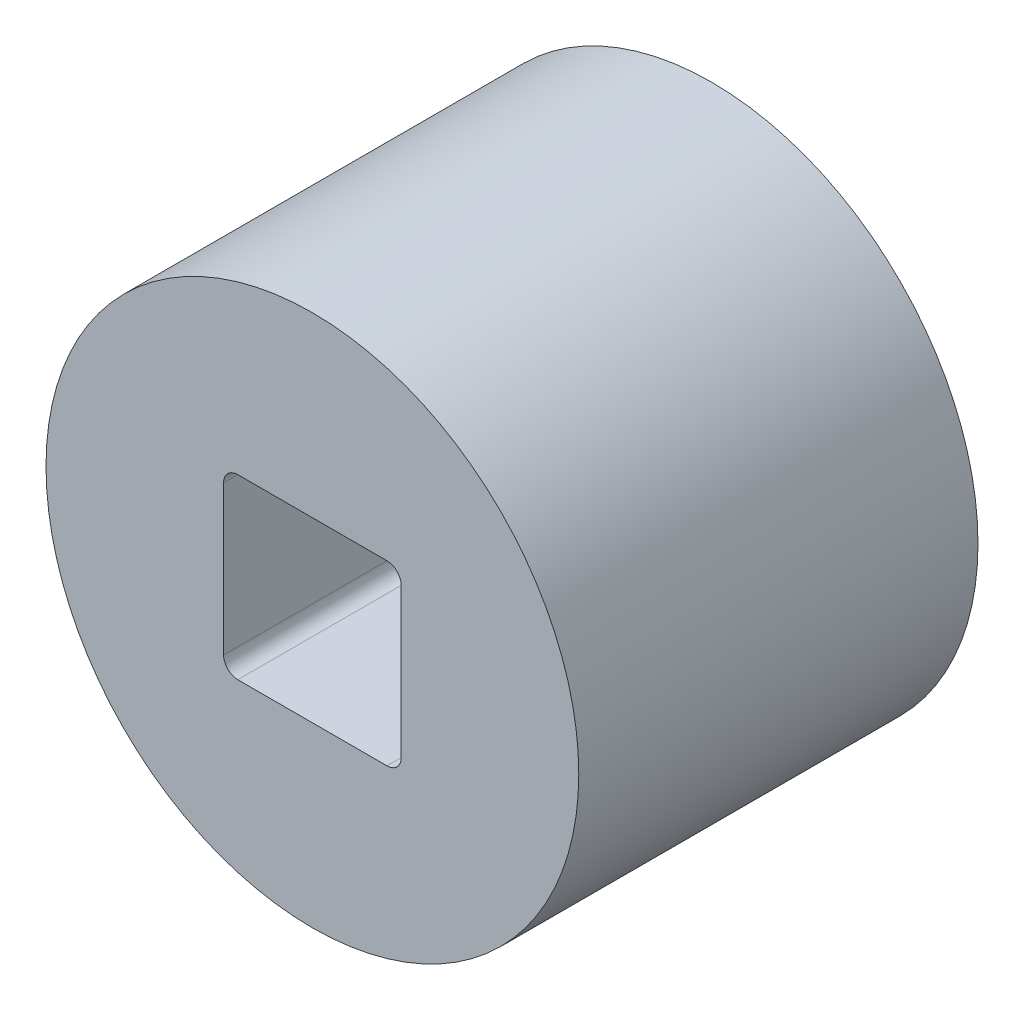
ISO-10303-21;
HEADER;
FILE_DESCRIPTION(('STEP AP214'),'2;1');
FILE_NAME('part.step','',(''),(''),'','','');
FILE_SCHEMA(('AUTOMOTIVE_DESIGN { 1 0 10303 214 1 1 1 1 }'));
ENDSEC;
DATA;
#1=APPLICATION_CONTEXT('core data for automotive mechanical design processes');
#2=APPLICATION_PROTOCOL_DEFINITION('international standard','automotive_design',2000,#1);
#3=PRODUCT_CONTEXT('',#1,'mechanical');
#4=PRODUCT('Part','Part','',(#3));
#5=PRODUCT_RELATED_PRODUCT_CATEGORY('part','',(#4));
#6=PRODUCT_DEFINITION_FORMATION('','',#4);
#7=PRODUCT_DEFINITION_CONTEXT('part definition',#1,'design');
#8=PRODUCT_DEFINITION('design','',#6,#7);
#9=PRODUCT_DEFINITION_SHAPE('','',#8);
#10=(LENGTH_UNIT() NAMED_UNIT(*) SI_UNIT(.MILLI.,.METRE.));
#11=(NAMED_UNIT(*) PLANE_ANGLE_UNIT() SI_UNIT($,.RADIAN.));
#12=(NAMED_UNIT(*) SI_UNIT($,.STERADIAN.) SOLID_ANGLE_UNIT());
#13=UNCERTAINTY_MEASURE_WITH_UNIT(LENGTH_MEASURE(1.E-05),#10,'distance_accuracy_value','');
#14=(GEOMETRIC_REPRESENTATION_CONTEXT(3) GLOBAL_UNCERTAINTY_ASSIGNED_CONTEXT((#13)) GLOBAL_UNIT_ASSIGNED_CONTEXT((#10,
#11,#12)) REPRESENTATION_CONTEXT('',''));
#15=CARTESIAN_POINT('',(0.,0.,0.));
#16=DIRECTION('',(0.,0.,1.));
#17=DIRECTION('',(1.,0.,0.));
#18=AXIS2_PLACEMENT_3D('',#15,#16,#17);
#19=CARTESIAN_POINT('',(0.,0.,7.1374));
#20=DIRECTION('',(0.,0.,1.));
#21=DIRECTION('',(1.,0.,0.));
#22=AXIS2_PLACEMENT_3D('',#19,#20,#21);
#23=PLANE('',#22);
#24=CARTESIAN_POINT('',(0.,0.,7.1374));
#25=DIRECTION('',(0.,0.,1.));
#26=DIRECTION('',(1.,0.,0.));
#27=AXIS2_PLACEMENT_3D('',#24,#25,#26);
#28=CIRCLE('',#27,4.7625);
#29=CARTESIAN_POINT('',(4.7625,0.,7.1374));
#30=VERTEX_POINT('',#29);
#31=EDGE_CURVE('E11',#30,#30,#28,.T.);
#32=ORIENTED_EDGE('',*,*,#31,.T.);
#33=EDGE_LOOP('',(#32));
#34=FACE_BOUND('',#33,.T.);
#35=DIRECTION('',(1.,0.,0.));
#36=VECTOR('',#35,1.);
#37=CARTESIAN_POINT('',(1.3335,-1.5875,7.1374));
#38=LINE('',#37,#36);
#39=CARTESIAN_POINT('',(-1.3335,-1.5875,7.1374));
#40=VERTEX_POINT('',#39);
#41=CARTESIAN_POINT('',(1.3335,-1.5875,7.1374));
#42=VERTEX_POINT('',#41);
#43=EDGE_CURVE('E114',#40,#42,#38,.T.);
#44=ORIENTED_EDGE('',*,*,#43,.F.);
#45=CARTESIAN_POINT('',(-1.3335,-1.3335,7.1374));
#46=DIRECTION('',(0.,0.,1.));
#47=DIRECTION('',(1.,0.,0.));
#48=AXIS2_PLACEMENT_3D('',#45,#46,#47);
#49=CIRCLE('',#48,0.254);
#50=CARTESIAN_POINT('',(-1.5875,-1.3335,7.1374));
#51=VERTEX_POINT('',#50);
#52=EDGE_CURVE('E105',#51,#40,#49,.T.);
#53=ORIENTED_EDGE('',*,*,#52,.F.);
#54=DIRECTION('',(0.,-1.,0.));
#55=VECTOR('',#54,1.);
#56=CARTESIAN_POINT('',(-1.5875,1.3335,7.1374));
#57=LINE('',#56,#55);
#58=CARTESIAN_POINT('',(-1.5875,1.3335,7.1374));
#59=VERTEX_POINT('',#58);
#60=EDGE_CURVE('E145',#59,#51,#57,.T.);
#61=ORIENTED_EDGE('',*,*,#60,.F.);
#62=CARTESIAN_POINT('',(-1.3335,1.3335,7.1374));
#63=DIRECTION('',(0.,0.,1.));
#64=DIRECTION('',(-1.,0.,0.));
#65=AXIS2_PLACEMENT_3D('',#62,#63,#64);
#66=CIRCLE('',#65,0.254);
#67=CARTESIAN_POINT('',(-1.3335,1.5875,7.1374));
#68=VERTEX_POINT('',#67);
#69=EDGE_CURVE('E142',#68,#59,#66,.T.);
#70=ORIENTED_EDGE('',*,*,#69,.F.);
#71=DIRECTION('',(-1.,0.,0.));
#72=VECTOR('',#71,1.);
#73=CARTESIAN_POINT('',(1.3335,1.5875,7.1374));
#74=LINE('',#73,#72);
#75=CARTESIAN_POINT('',(1.3335,1.5875,7.1374));
#76=VERTEX_POINT('',#75);
#77=EDGE_CURVE('E139',#76,#68,#74,.T.);
#78=ORIENTED_EDGE('',*,*,#77,.F.);
#79=CARTESIAN_POINT('',(1.3335,1.3335,7.1374));
#80=DIRECTION('',(0.,0.,1.));
#81=DIRECTION('',(1.,0.,0.));
#82=AXIS2_PLACEMENT_3D('',#79,#80,#81);
#83=CIRCLE('',#82,0.254);
#84=CARTESIAN_POINT('',(1.5875,1.3335,7.1374));
#85=VERTEX_POINT('',#84);
#86=EDGE_CURVE('E136',#85,#76,#83,.T.);
#87=ORIENTED_EDGE('',*,*,#86,.F.);
#88=DIRECTION('',(0.,1.,0.));
#89=VECTOR('',#88,1.);
#90=CARTESIAN_POINT('',(1.5875,1.3335,7.1374));
#91=LINE('',#90,#89);
#92=CARTESIAN_POINT('',(1.5875,-1.3335,7.1374));
#93=VERTEX_POINT('',#92);
#94=EDGE_CURVE('E131',#93,#85,#91,.T.);
#95=ORIENTED_EDGE('',*,*,#94,.F.);
#96=CARTESIAN_POINT('',(1.3335,-1.3335,7.1374));
#97=DIRECTION('',(0.,0.,1.));
#98=DIRECTION('',(1.,0.,0.));
#99=AXIS2_PLACEMENT_3D('',#96,#97,#98);
#100=CIRCLE('',#99,0.254);
#101=EDGE_CURVE('E127',#42,#93,#100,.T.);
#102=ORIENTED_EDGE('',*,*,#101,.F.);
#103=EDGE_LOOP('',(#44,#53,#61,#70,#78,#87,#95,#102));
#104=FACE_BOUND('',#103,.T.);
#105=ADVANCED_FACE('F39',(#34,#104),#23,.T.);
#106=CARTESIAN_POINT('',(0.,0.,0.));
#107=DIRECTION('',(0.,0.,1.));
#108=DIRECTION('',(1.,0.,0.));
#109=AXIS2_PLACEMENT_3D('',#106,#107,#108);
#110=PLANE('',#109);
#111=CARTESIAN_POINT('',(0.,0.,0.));
#112=DIRECTION('',(0.,0.,1.));
#113=DIRECTION('',(1.,0.,0.));
#114=AXIS2_PLACEMENT_3D('',#111,#112,#113);
#115=CIRCLE('',#114,4.7625);
#116=CARTESIAN_POINT('',(4.7625,0.,0.));
#117=VERTEX_POINT('',#116);
#118=EDGE_CURVE('E43',#117,#117,#115,.T.);
#119=ORIENTED_EDGE('',*,*,#118,.F.);
#120=EDGE_LOOP('',(#119));
#121=FACE_BOUND('',#120,.T.);
#122=CARTESIAN_POINT('',(-1.3335,-1.3335,0.));
#123=DIRECTION('',(0.,0.,1.));
#124=DIRECTION('',(1.,0.,0.));
#125=AXIS2_PLACEMENT_3D('',#122,#123,#124);
#126=CIRCLE('',#125,0.254);
#127=CARTESIAN_POINT('',(-1.5875,-1.3335,0.));
#128=VERTEX_POINT('',#127);
#129=CARTESIAN_POINT('',(-1.3335,-1.5875,0.));
#130=VERTEX_POINT('',#129);
#131=EDGE_CURVE('E63',#128,#130,#126,.T.);
#132=ORIENTED_EDGE('',*,*,#131,.T.);
#133=DIRECTION('',(1.,0.,0.));
#134=VECTOR('',#133,1.);
#135=CARTESIAN_POINT('',(1.3335,-1.5875,0.));
#136=LINE('',#135,#134);
#137=CARTESIAN_POINT('',(1.3335,-1.5875,0.));
#138=VERTEX_POINT('',#137);
#139=EDGE_CURVE('E121',#130,#138,#136,.T.);
#140=ORIENTED_EDGE('',*,*,#139,.T.);
#141=CARTESIAN_POINT('',(1.3335,-1.3335,0.));
#142=DIRECTION('',(0.,0.,1.));
#143=DIRECTION('',(1.,0.,0.));
#144=AXIS2_PLACEMENT_3D('',#141,#142,#143);
#145=CIRCLE('',#144,0.254);
#146=CARTESIAN_POINT('',(1.5875,-1.3335,0.));
#147=VERTEX_POINT('',#146);
#148=EDGE_CURVE('E152',#138,#147,#145,.T.);
#149=ORIENTED_EDGE('',*,*,#148,.T.);
#150=DIRECTION('',(0.,1.,0.));
#151=VECTOR('',#150,1.);
#152=CARTESIAN_POINT('',(1.5875,1.3335,0.));
#153=LINE('',#152,#151);
#154=CARTESIAN_POINT('',(1.5875,1.3335,0.));
#155=VERTEX_POINT('',#154);
#156=EDGE_CURVE('E156',#147,#155,#153,.T.);
#157=ORIENTED_EDGE('',*,*,#156,.T.);
#158=CARTESIAN_POINT('',(1.3335,1.3335,0.));
#159=DIRECTION('',(0.,0.,1.));
#160=DIRECTION('',(1.,0.,0.));
#161=AXIS2_PLACEMENT_3D('',#158,#159,#160);
#162=CIRCLE('',#161,0.254);
#163=CARTESIAN_POINT('',(1.3335,1.5875,0.));
#164=VERTEX_POINT('',#163);
#165=EDGE_CURVE('E160',#155,#164,#162,.T.);
#166=ORIENTED_EDGE('',*,*,#165,.T.);
#167=DIRECTION('',(-1.,0.,0.));
#168=VECTOR('',#167,1.);
#169=CARTESIAN_POINT('',(1.3335,1.5875,0.));
#170=LINE('',#169,#168);
#171=CARTESIAN_POINT('',(-1.3335,1.5875,0.));
#172=VERTEX_POINT('',#171);
#173=EDGE_CURVE('E164',#164,#172,#170,.T.);
#174=ORIENTED_EDGE('',*,*,#173,.T.);
#175=CARTESIAN_POINT('',(-1.3335,1.3335,0.));
#176=DIRECTION('',(0.,0.,1.));
#177=DIRECTION('',(-1.,0.,0.));
#178=AXIS2_PLACEMENT_3D('',#175,#176,#177);
#179=CIRCLE('',#178,0.254);
#180=CARTESIAN_POINT('',(-1.5875,1.3335,0.));
#181=VERTEX_POINT('',#180);
#182=EDGE_CURVE('E168',#172,#181,#179,.T.);
#183=ORIENTED_EDGE('',*,*,#182,.T.);
#184=DIRECTION('',(0.,-1.,0.));
#185=VECTOR('',#184,1.);
#186=CARTESIAN_POINT('',(-1.5875,1.3335,0.));
#187=LINE('',#186,#185);
#188=EDGE_CURVE('E115',#181,#128,#187,.T.);
#189=ORIENTED_EDGE('',*,*,#188,.T.);
#190=EDGE_LOOP('',(#132,#140,#149,#157,#166,#174,#183,#189));
#191=FACE_BOUND('',#190,.T.);
#192=ADVANCED_FACE('F198',(#121,#191),#110,.F.);
#193=CARTESIAN_POINT('',(0.,0.,7.1374));
#194=DIRECTION('',(0.,0.,-1.));
#195=DIRECTION('',(-1.,0.,0.));
#196=AXIS2_PLACEMENT_3D('',#193,#194,#195);
#197=CYLINDRICAL_SURFACE('',#196,4.7625);
#198=ORIENTED_EDGE('',*,*,#31,.F.);
#199=EDGE_LOOP('',(#198));
#200=FACE_BOUND('',#199,.T.);
#201=ORIENTED_EDGE('',*,*,#118,.T.);
#202=EDGE_LOOP('',(#201));
#203=FACE_BOUND('',#202,.T.);
#204=ADVANCED_FACE('F41',(#200,#203),#197,.T.);
#205=CARTESIAN_POINT('',(-1.3335,-1.3335,7.1374));
#206=DIRECTION('',(0.,0.,-1.));
#207=DIRECTION('',(-1.,0.,0.));
#208=AXIS2_PLACEMENT_3D('',#205,#206,#207);
#209=CYLINDRICAL_SURFACE('',#208,0.254);
#210=ORIENTED_EDGE('',*,*,#131,.F.);
#211=DIRECTION('',(0.,0.,-1.));
#212=VECTOR('',#211,1.);
#213=CARTESIAN_POINT('',(-1.5875,-1.3335,7.1374));
#214=LINE('',#213,#212);
#215=EDGE_CURVE('E109',#51,#128,#214,.T.);
#216=ORIENTED_EDGE('',*,*,#215,.F.);
#217=ORIENTED_EDGE('',*,*,#52,.T.);
#218=DIRECTION('',(0.,0.,-1.));
#219=VECTOR('',#218,1.);
#220=CARTESIAN_POINT('',(-1.3335,-1.5875,7.1374));
#221=LINE('',#220,#219);
#222=EDGE_CURVE('E108',#40,#130,#221,.T.);
#223=ORIENTED_EDGE('',*,*,#222,.T.);
#224=EDGE_LOOP('',(#210,#216,#217,#223));
#225=FACE_BOUND('',#224,.T.);
#226=ADVANCED_FACE('F107',(#225),#209,.F.);
#227=CARTESIAN_POINT('',(1.3335,-1.5875,7.1374));
#228=DIRECTION('',(0.,1.,0.));
#229=DIRECTION('',(-1.,0.,0.));
#230=AXIS2_PLACEMENT_3D('',#227,#228,#229);
#231=PLANE('',#230);
#232=ORIENTED_EDGE('',*,*,#139,.F.);
#233=ORIENTED_EDGE('',*,*,#222,.F.);
#234=ORIENTED_EDGE('',*,*,#43,.T.);
#235=DIRECTION('',(0.,0.,-1.));
#236=VECTOR('',#235,1.);
#237=CARTESIAN_POINT('',(1.3335,-1.5875,7.1374));
#238=LINE('',#237,#236);
#239=EDGE_CURVE('E123',#42,#138,#238,.T.);
#240=ORIENTED_EDGE('',*,*,#239,.T.);
#241=EDGE_LOOP('',(#232,#233,#234,#240));
#242=FACE_BOUND('',#241,.T.);
#243=ADVANCED_FACE('F118',(#242),#231,.T.);
#244=CARTESIAN_POINT('',(1.3335,-1.3335,7.1374));
#245=DIRECTION('',(0.,0.,-1.));
#246=DIRECTION('',(-1.,0.,0.));
#247=AXIS2_PLACEMENT_3D('',#244,#245,#246);
#248=CYLINDRICAL_SURFACE('',#247,0.254);
#249=ORIENTED_EDGE('',*,*,#148,.F.);
#250=ORIENTED_EDGE('',*,*,#239,.F.);
#251=ORIENTED_EDGE('',*,*,#101,.T.);
#252=DIRECTION('',(0.,0.,-1.));
#253=VECTOR('',#252,1.);
#254=CARTESIAN_POINT('',(1.5875,-1.3335,7.1374));
#255=LINE('',#254,#253);
#256=EDGE_CURVE('E188',#93,#147,#255,.T.);
#257=ORIENTED_EDGE('',*,*,#256,.T.);
#258=EDGE_LOOP('',(#249,#250,#251,#257));
#259=FACE_BOUND('',#258,.T.);
#260=ADVANCED_FACE('F194',(#259),#248,.F.);
#261=CARTESIAN_POINT('',(1.5875,1.3335,7.1374));
#262=DIRECTION('',(-1.,0.,0.));
#263=DIRECTION('',(0.,-1.,0.));
#264=AXIS2_PLACEMENT_3D('',#261,#262,#263);
#265=PLANE('',#264);
#266=ORIENTED_EDGE('',*,*,#156,.F.);
#267=ORIENTED_EDGE('',*,*,#256,.F.);
#268=ORIENTED_EDGE('',*,*,#94,.T.);
#269=DIRECTION('',(0.,0.,-1.));
#270=VECTOR('',#269,1.);
#271=CARTESIAN_POINT('',(1.5875,1.3335,7.1374));
#272=LINE('',#271,#270);
#273=EDGE_CURVE('E185',#85,#155,#272,.T.);
#274=ORIENTED_EDGE('',*,*,#273,.T.);
#275=EDGE_LOOP('',(#266,#267,#268,#274));
#276=FACE_BOUND('',#275,.T.);
#277=ADVANCED_FACE('F216',(#276),#265,.T.);
#278=CARTESIAN_POINT('',(1.3335,1.3335,7.1374));
#279=DIRECTION('',(0.,0.,-1.));
#280=DIRECTION('',(-1.,0.,0.));
#281=AXIS2_PLACEMENT_3D('',#278,#279,#280);
#282=CYLINDRICAL_SURFACE('',#281,0.254);
#283=ORIENTED_EDGE('',*,*,#165,.F.);
#284=ORIENTED_EDGE('',*,*,#273,.F.);
#285=ORIENTED_EDGE('',*,*,#86,.T.);
#286=DIRECTION('',(0.,0.,-1.));
#287=VECTOR('',#286,1.);
#288=CARTESIAN_POINT('',(1.3335,1.5875,7.1374));
#289=LINE('',#288,#287);
#290=EDGE_CURVE('E182',#76,#164,#289,.T.);
#291=ORIENTED_EDGE('',*,*,#290,.T.);
#292=EDGE_LOOP('',(#283,#284,#285,#291));
#293=FACE_BOUND('',#292,.T.);
#294=ADVANCED_FACE('F213',(#293),#282,.F.);
#295=CARTESIAN_POINT('',(1.3335,1.5875,7.1374));
#296=DIRECTION('',(0.,-1.,0.));
#297=DIRECTION('',(1.,0.,0.));
#298=AXIS2_PLACEMENT_3D('',#295,#296,#297);
#299=PLANE('',#298);
#300=ORIENTED_EDGE('',*,*,#173,.F.);
#301=ORIENTED_EDGE('',*,*,#290,.F.);
#302=ORIENTED_EDGE('',*,*,#77,.T.);
#303=DIRECTION('',(0.,0.,-1.));
#304=VECTOR('',#303,1.);
#305=CARTESIAN_POINT('',(-1.3335,1.5875,7.1374));
#306=LINE('',#305,#304);
#307=EDGE_CURVE('E179',#68,#172,#306,.T.);
#308=ORIENTED_EDGE('',*,*,#307,.T.);
#309=EDGE_LOOP('',(#300,#301,#302,#308));
#310=FACE_BOUND('',#309,.T.);
#311=ADVANCED_FACE('F209',(#310),#299,.T.);
#312=CARTESIAN_POINT('',(-1.3335,1.3335,7.1374));
#313=DIRECTION('',(0.,0.,-1.));
#314=DIRECTION('',(-1.,0.,0.));
#315=AXIS2_PLACEMENT_3D('',#312,#313,#314);
#316=CYLINDRICAL_SURFACE('',#315,0.254);
#317=ORIENTED_EDGE('',*,*,#182,.F.);
#318=ORIENTED_EDGE('',*,*,#307,.F.);
#319=ORIENTED_EDGE('',*,*,#69,.T.);
#320=DIRECTION('',(0.,0.,-1.));
#321=VECTOR('',#320,1.);
#322=CARTESIAN_POINT('',(-1.5875,1.3335,7.1374));
#323=LINE('',#322,#321);
#324=EDGE_CURVE('E55',#59,#181,#323,.T.);
#325=ORIENTED_EDGE('',*,*,#324,.T.);
#326=EDGE_LOOP('',(#317,#318,#319,#325));
#327=FACE_BOUND('',#326,.T.);
#328=ADVANCED_FACE('F206',(#327),#316,.F.);
#329=CARTESIAN_POINT('',(-1.5875,1.3335,7.1374));
#330=DIRECTION('',(1.,0.,0.));
#331=DIRECTION('',(0.,1.,0.));
#332=AXIS2_PLACEMENT_3D('',#329,#330,#331);
#333=PLANE('',#332);
#334=ORIENTED_EDGE('',*,*,#188,.F.);
#335=ORIENTED_EDGE('',*,*,#324,.F.);
#336=ORIENTED_EDGE('',*,*,#60,.T.);
#337=ORIENTED_EDGE('',*,*,#215,.T.);
#338=EDGE_LOOP('',(#334,#335,#336,#337));
#339=FACE_BOUND('',#338,.T.);
#340=ADVANCED_FACE('F200',(#339),#333,.T.);
#341=CLOSED_SHELL('',(#105,#192,#204,#226,#243,#260,#277,#294,#311,#328,#340));
#342=MANIFOLD_SOLID_BREP('B2',#341);
#343=ADVANCED_BREP_SHAPE_REPRESENTATION('',(#18,#342),#14);
#344=SHAPE_DEFINITION_REPRESENTATION(#9,#343);
ENDSEC;
END-ISO-10303-21;
